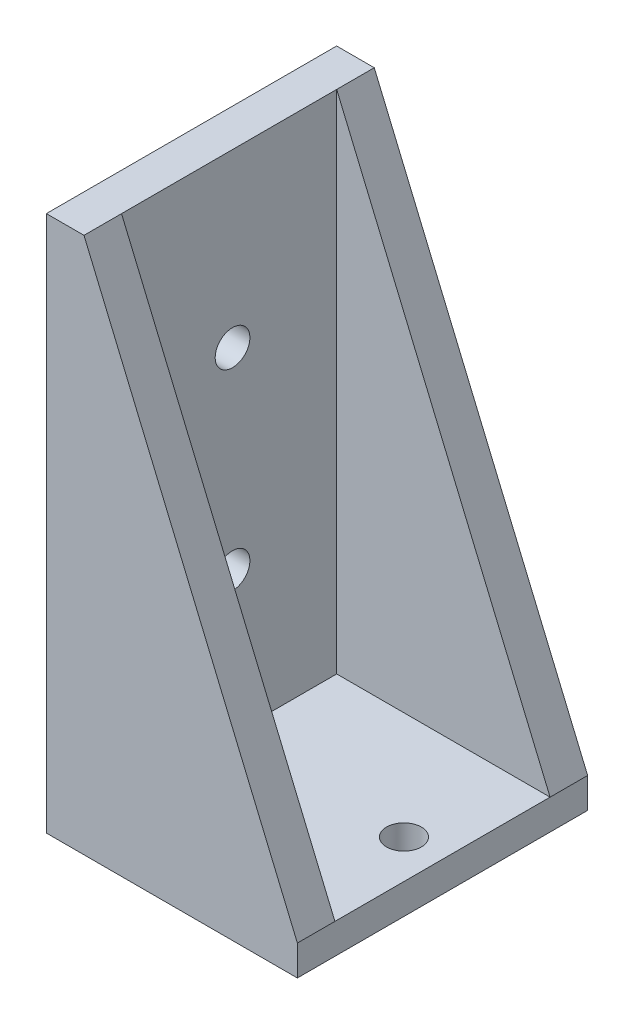
ISO-10303-21;
HEADER;
FILE_DESCRIPTION(('STEP AP214'),'2;1');
FILE_NAME('part.step','',(''),(''),'','','');
FILE_SCHEMA(('AUTOMOTIVE_DESIGN { 1 0 10303 214 1 1 1 1 }'));
ENDSEC;
DATA;
#1=APPLICATION_CONTEXT('core data for automotive mechanical design processes');
#2=APPLICATION_PROTOCOL_DEFINITION('international standard','automotive_design',2000,#1);
#3=PRODUCT_CONTEXT('',#1,'mechanical');
#4=PRODUCT('Part','Part','',(#3));
#5=PRODUCT_RELATED_PRODUCT_CATEGORY('part','',(#4));
#6=PRODUCT_DEFINITION_FORMATION('','',#4);
#7=PRODUCT_DEFINITION_CONTEXT('part definition',#1,'design');
#8=PRODUCT_DEFINITION('design','',#6,#7);
#9=PRODUCT_DEFINITION_SHAPE('','',#8);
#10=(LENGTH_UNIT() NAMED_UNIT(*) SI_UNIT(.MILLI.,.METRE.));
#11=(NAMED_UNIT(*) PLANE_ANGLE_UNIT() SI_UNIT($,.RADIAN.));
#12=(NAMED_UNIT(*) SI_UNIT($,.STERADIAN.) SOLID_ANGLE_UNIT());
#13=UNCERTAINTY_MEASURE_WITH_UNIT(LENGTH_MEASURE(1.E-05),#10,'distance_accuracy_value','');
#14=(GEOMETRIC_REPRESENTATION_CONTEXT(3) GLOBAL_UNCERTAINTY_ASSIGNED_CONTEXT((#13)) GLOBAL_UNIT_ASSIGNED_CONTEXT((#10,
#11,#12)) REPRESENTATION_CONTEXT('',''));
#15=CARTESIAN_POINT('',(0.,0.,0.));
#16=DIRECTION('',(0.,0.,1.));
#17=DIRECTION('',(1.,0.,0.));
#18=AXIS2_PLACEMENT_3D('',#15,#16,#17);
#19=CARTESIAN_POINT('',(1.84333031674209,26.29,14.224));
#20=DIRECTION('',(-0.921482768315552,-0.388419242182345,0.));
#21=DIRECTION('',(0.388419242182345,-0.921482768315552,0.));
#22=AXIS2_PLACEMENT_3D('',#19,#20,#21);
#23=PLANE('',#22);
#24=DIRECTION('',(0.,0.,-1.));
#25=VECTOR('',#24,1.);
#26=CARTESIAN_POINT('',(1.84333031674209,26.29,14.224));
#27=LINE('',#26,#25);
#28=CARTESIAN_POINT('',(1.84333031674209,26.29,1.84));
#29=VERTEX_POINT('',#28);
#30=CARTESIAN_POINT('',(1.84333031674209,26.29,0.));
#31=VERTEX_POINT('',#30);
#32=EDGE_CURVE('E142',#29,#31,#27,.T.);
#33=ORIENTED_EDGE('',*,*,#32,.F.);
#34=DIRECTION('',(0.388419242182345,-0.921482768315552,0.));
#35=VECTOR('',#34,1.);
#36=CARTESIAN_POINT('',(1.84333031674209,26.29,1.84));
#37=LINE('',#36,#35);
#38=CARTESIAN_POINT('',(12.3,1.48267873303167,1.84));
#39=VERTEX_POINT('',#38);
#40=EDGE_CURVE('E11',#29,#39,#37,.T.);
#41=ORIENTED_EDGE('',*,*,#40,.T.);
#42=DIRECTION('',(0.,0.,-1.));
#43=VECTOR('',#42,1.);
#44=CARTESIAN_POINT('',(12.3,1.48267873303167,14.224));
#45=LINE('',#44,#43);
#46=CARTESIAN_POINT('',(12.3,1.48267873303167,0.));
#47=VERTEX_POINT('',#46);
#48=EDGE_CURVE('E119',#39,#47,#45,.T.);
#49=ORIENTED_EDGE('',*,*,#48,.T.);
#50=DIRECTION('',(-0.388419242182345,0.921482768315552,0.));
#51=VECTOR('',#50,1.);
#52=CARTESIAN_POINT('',(1.84333031674209,26.29,0.));
#53=LINE('',#52,#51);
#54=EDGE_CURVE('E136',#47,#31,#53,.T.);
#55=ORIENTED_EDGE('',*,*,#54,.T.);
#56=EDGE_LOOP('',(#33,#41,#49,#55));
#57=FACE_BOUND('',#56,.T.);
#58=ADVANCED_FACE('F33',(#57),#23,.F.);
#59=CARTESIAN_POINT('',(0.,0.,14.224));
#60=DIRECTION('',(1.,0.,0.));
#61=DIRECTION('',(0.,0.,-1.));
#62=AXIS2_PLACEMENT_3D('',#59,#60,#61);
#63=PLANE('',#62);
#64=CARTESIAN_POINT('',(0.,8.41708984317265,6.94399085779678));
#65=DIRECTION('',(-1.,0.,0.));
#66=DIRECTION('',(0.,0.,1.));
#67=AXIS2_PLACEMENT_3D('',#64,#65,#66);
#68=CIRCLE('',#67,0.8509);
#69=CARTESIAN_POINT('',(0.,8.41708984317265,7.79489085779678));
#70=VERTEX_POINT('',#69);
#71=EDGE_CURVE('E160',#70,#70,#68,.T.);
#72=ORIENTED_EDGE('',*,*,#71,.F.);
#73=EDGE_LOOP('',(#72));
#74=FACE_BOUND('',#73,.T.);
#75=CARTESIAN_POINT('',(0.,17.8834712620218,6.94399085779678));
#76=DIRECTION('',(-1.,0.,0.));
#77=DIRECTION('',(0.,0.,1.));
#78=AXIS2_PLACEMENT_3D('',#75,#76,#77);
#79=CIRCLE('',#78,0.850899999999998);
#80=CARTESIAN_POINT('',(0.,17.8834712620218,7.79489085779678));
#81=VERTEX_POINT('',#80);
#82=EDGE_CURVE('E150',#81,#81,#79,.T.);
#83=ORIENTED_EDGE('',*,*,#82,.F.);
#84=EDGE_LOOP('',(#83));
#85=FACE_BOUND('',#84,.T.);
#86=DIRECTION('',(0.,-1.,0.));
#87=VECTOR('',#86,1.);
#88=CARTESIAN_POINT('',(0.,0.,0.));
#89=LINE('',#88,#87);
#90=CARTESIAN_POINT('',(0.,26.29,0.));
#91=VERTEX_POINT('',#90);
#92=CARTESIAN_POINT('',(0.,0.,0.));
#93=VERTEX_POINT('',#92);
#94=EDGE_CURVE('E129',#91,#93,#89,.T.);
#95=ORIENTED_EDGE('',*,*,#94,.T.);
#96=DIRECTION('',(0.,0.,-1.));
#97=VECTOR('',#96,1.);
#98=CARTESIAN_POINT('',(0.,0.,14.224));
#99=LINE('',#98,#97);
#100=CARTESIAN_POINT('',(0.,0.,14.224));
#101=VERTEX_POINT('',#100);
#102=EDGE_CURVE('E145',#101,#93,#99,.T.);
#103=ORIENTED_EDGE('',*,*,#102,.F.);
#104=DIRECTION('',(0.,-1.,0.));
#105=VECTOR('',#104,1.);
#106=CARTESIAN_POINT('',(0.,0.,14.224));
#107=LINE('',#106,#105);
#108=CARTESIAN_POINT('',(0.,26.29,14.224));
#109=VERTEX_POINT('',#108);
#110=EDGE_CURVE('E140',#109,#101,#107,.T.);
#111=ORIENTED_EDGE('',*,*,#110,.F.);
#112=DIRECTION('',(0.,0.,-1.));
#113=VECTOR('',#112,1.);
#114=CARTESIAN_POINT('',(0.,26.29,14.224));
#115=LINE('',#114,#113);
#116=EDGE_CURVE('E125',#109,#91,#115,.T.);
#117=ORIENTED_EDGE('',*,*,#116,.T.);
#118=EDGE_LOOP('',(#95,#103,#111,#117));
#119=FACE_BOUND('',#118,.T.);
#120=ADVANCED_FACE('F35',(#74,#85,#119),#63,.F.);
#121=CARTESIAN_POINT('',(0.,0.,14.224));
#122=DIRECTION('',(0.,1.,0.));
#123=DIRECTION('',(0.,0.,1.));
#124=AXIS2_PLACEMENT_3D('',#121,#122,#123);
#125=PLANE('',#124);
#126=CARTESIAN_POINT('',(0.943553489440477,0.,7.112));
#127=DIRECTION('',(0.,-1.,0.));
#128=DIRECTION('',(0.,0.,-1.));
#129=AXIS2_PLACEMENT_3D('',#126,#127,#128);
#130=CIRCLE('',#129,0.8509);
#131=CARTESIAN_POINT('',(0.943553489440477,0.,6.2611));
#132=VERTEX_POINT('',#131);
#133=EDGE_CURVE('E229',#132,#132,#130,.T.);
#134=ORIENTED_EDGE('',*,*,#133,.F.);
#135=EDGE_LOOP('',(#134));
#136=FACE_BOUND('',#135,.T.);
#137=CARTESIAN_POINT('',(10.4099349082896,0.,7.112));
#138=DIRECTION('',(0.,-1.,0.));
#139=DIRECTION('',(0.,0.,-1.));
#140=AXIS2_PLACEMENT_3D('',#137,#138,#139);
#141=CIRCLE('',#140,0.850900000000001);
#142=CARTESIAN_POINT('',(10.4099349082896,0.,6.2611));
#143=VERTEX_POINT('',#142);
#144=EDGE_CURVE('E232',#143,#143,#141,.T.);
#145=ORIENTED_EDGE('',*,*,#144,.F.);
#146=EDGE_LOOP('',(#145));
#147=FACE_BOUND('',#146,.T.);
#148=DIRECTION('',(1.,0.,0.));
#149=VECTOR('',#148,1.);
#150=CARTESIAN_POINT('',(0.,0.,0.));
#151=LINE('',#150,#149);
#152=CARTESIAN_POINT('',(12.3,0.,0.));
#153=VERTEX_POINT('',#152);
#154=EDGE_CURVE('E132',#93,#153,#151,.T.);
#155=ORIENTED_EDGE('',*,*,#154,.T.);
#156=DIRECTION('',(0.,0.,-1.));
#157=VECTOR('',#156,1.);
#158=CARTESIAN_POINT('',(12.3,0.,14.224));
#159=LINE('',#158,#157);
#160=CARTESIAN_POINT('',(12.3,0.,14.224));
#161=VERTEX_POINT('',#160);
#162=EDGE_CURVE('E118',#161,#153,#159,.T.);
#163=ORIENTED_EDGE('',*,*,#162,.F.);
#164=DIRECTION('',(1.,0.,0.));
#165=VECTOR('',#164,1.);
#166=CARTESIAN_POINT('',(0.,0.,14.224));
#167=LINE('',#166,#165);
#168=EDGE_CURVE('E91',#101,#161,#167,.T.);
#169=ORIENTED_EDGE('',*,*,#168,.F.);
#170=ORIENTED_EDGE('',*,*,#102,.T.);
#171=EDGE_LOOP('',(#155,#163,#169,#170));
#172=FACE_BOUND('',#171,.T.);
#173=ADVANCED_FACE('F181',(#136,#147,#172),#125,.F.);
#174=CARTESIAN_POINT('',(12.3,0.,14.224));
#175=DIRECTION('',(-1.,0.,0.));
#176=DIRECTION('',(0.,0.,1.));
#177=AXIS2_PLACEMENT_3D('',#174,#175,#176);
#178=PLANE('',#177);
#179=DIRECTION('',(0.,1.,0.));
#180=VECTOR('',#179,1.);
#181=CARTESIAN_POINT('',(12.3,0.,0.));
#182=LINE('',#181,#180);
#183=EDGE_CURVE('E134',#153,#47,#182,.T.);
#184=ORIENTED_EDGE('',*,*,#183,.T.);
#185=ORIENTED_EDGE('',*,*,#48,.F.);
#186=DIRECTION('',(0.,0.,-1.));
#187=VECTOR('',#186,1.);
#188=CARTESIAN_POINT('',(12.3,1.48267873303167,1.84));
#189=LINE('',#188,#187);
#190=CARTESIAN_POINT('',(12.3,1.48267873303167,12.384));
#191=VERTEX_POINT('',#190);
#192=EDGE_CURVE('E115',#191,#39,#189,.T.);
#193=ORIENTED_EDGE('',*,*,#192,.F.);
#194=CARTESIAN_POINT('',(12.3,1.48267873303167,14.224));
#195=VERTEX_POINT('',#194);
#196=EDGE_CURVE('E109',#195,#191,#45,.T.);
#197=ORIENTED_EDGE('',*,*,#196,.F.);
#198=DIRECTION('',(0.,1.,0.));
#199=VECTOR('',#198,1.);
#200=CARTESIAN_POINT('',(12.3,0.,14.224));
#201=LINE('',#200,#199);
#202=EDGE_CURVE('E98',#161,#195,#201,.T.);
#203=ORIENTED_EDGE('',*,*,#202,.F.);
#204=ORIENTED_EDGE('',*,*,#162,.T.);
#205=EDGE_LOOP('',(#184,#185,#193,#197,#203,#204));
#206=FACE_BOUND('',#205,.T.);
#207=ADVANCED_FACE('F111',(#206),#178,.F.);
#208=ORIENTED_EDGE('',*,*,#196,.T.);
#209=DIRECTION('',(-0.388419242182345,0.921482768315552,0.));
#210=VECTOR('',#209,1.);
#211=CARTESIAN_POINT('',(1.84333031674209,26.29,12.384));
#212=LINE('',#211,#210);
#213=CARTESIAN_POINT('',(1.84333031674209,26.29,12.384));
#214=VERTEX_POINT('',#213);
#215=EDGE_CURVE('E42',#191,#214,#212,.T.);
#216=ORIENTED_EDGE('',*,*,#215,.T.);
#217=CARTESIAN_POINT('',(1.84333031674209,26.29,14.224));
#218=VERTEX_POINT('',#217);
#219=EDGE_CURVE('E123',#218,#214,#27,.T.);
#220=ORIENTED_EDGE('',*,*,#219,.F.);
#221=DIRECTION('',(-0.388419242182345,0.921482768315552,0.));
#222=VECTOR('',#221,1.);
#223=CARTESIAN_POINT('',(1.84333031674209,26.29,14.224));
#224=LINE('',#223,#222);
#225=EDGE_CURVE('E102',#195,#218,#224,.T.);
#226=ORIENTED_EDGE('',*,*,#225,.F.);
#227=EDGE_LOOP('',(#208,#216,#220,#226));
#228=FACE_BOUND('',#227,.T.);
#229=ADVANCED_FACE('F121',(#228),#23,.F.);
#230=CARTESIAN_POINT('',(0.,26.29,14.224));
#231=DIRECTION('',(0.,-1.,0.));
#232=DIRECTION('',(0.,0.,-1.));
#233=AXIS2_PLACEMENT_3D('',#230,#231,#232);
#234=PLANE('',#233);
#235=DIRECTION('',(-1.,0.,0.));
#236=VECTOR('',#235,1.);
#237=CARTESIAN_POINT('',(0.,26.29,0.));
#238=LINE('',#237,#236);
#239=EDGE_CURVE('E82',#31,#91,#238,.T.);
#240=ORIENTED_EDGE('',*,*,#239,.T.);
#241=ORIENTED_EDGE('',*,*,#116,.F.);
#242=DIRECTION('',(-1.,0.,0.));
#243=VECTOR('',#242,1.);
#244=CARTESIAN_POINT('',(0.,26.29,14.224));
#245=LINE('',#244,#243);
#246=EDGE_CURVE('E59',#218,#109,#245,.T.);
#247=ORIENTED_EDGE('',*,*,#246,.F.);
#248=ORIENTED_EDGE('',*,*,#219,.T.);
#249=DIRECTION('',(0.,0.,1.));
#250=VECTOR('',#249,1.);
#251=CARTESIAN_POINT('',(1.84333031674209,26.29,1.84));
#252=LINE('',#251,#250);
#253=EDGE_CURVE('E149',#29,#214,#252,.T.);
#254=ORIENTED_EDGE('',*,*,#253,.F.);
#255=ORIENTED_EDGE('',*,*,#32,.T.);
#256=EDGE_LOOP('',(#240,#241,#247,#248,#254,#255));
#257=FACE_BOUND('',#256,.T.);
#258=ADVANCED_FACE('F202',(#257),#234,.F.);
#259=CARTESIAN_POINT('',(0.,0.,14.224));
#260=DIRECTION('',(0.,0.,-1.));
#261=DIRECTION('',(-1.,0.,0.));
#262=AXIS2_PLACEMENT_3D('',#259,#260,#261);
#263=PLANE('',#262);
#264=ORIENTED_EDGE('',*,*,#110,.T.);
#265=ORIENTED_EDGE('',*,*,#168,.T.);
#266=ORIENTED_EDGE('',*,*,#202,.T.);
#267=ORIENTED_EDGE('',*,*,#225,.T.);
#268=ORIENTED_EDGE('',*,*,#246,.T.);
#269=EDGE_LOOP('',(#264,#265,#266,#267,#268));
#270=FACE_BOUND('',#269,.T.);
#271=ADVANCED_FACE('F100',(#270),#263,.F.);
#272=CARTESIAN_POINT('',(0.,0.,0.));
#273=DIRECTION('',(0.,0.,-1.));
#274=DIRECTION('',(-1.,0.,0.));
#275=AXIS2_PLACEMENT_3D('',#272,#273,#274);
#276=PLANE('',#275);
#277=ORIENTED_EDGE('',*,*,#94,.F.);
#278=ORIENTED_EDGE('',*,*,#239,.F.);
#279=ORIENTED_EDGE('',*,*,#54,.F.);
#280=ORIENTED_EDGE('',*,*,#183,.F.);
#281=ORIENTED_EDGE('',*,*,#154,.F.);
#282=EDGE_LOOP('',(#277,#278,#279,#280,#281));
#283=FACE_BOUND('',#282,.T.);
#284=ADVANCED_FACE('F185',(#283),#276,.T.);
#285=CARTESIAN_POINT('',(1.84333031674209,1.48267873303167,1.84));
#286=DIRECTION('',(0.,0.,-1.));
#287=DIRECTION('',(-1.,0.,0.));
#288=AXIS2_PLACEMENT_3D('',#285,#286,#287);
#289=PLANE('',#288);
#290=DIRECTION('',(0.,1.,0.));
#291=VECTOR('',#290,1.);
#292=CARTESIAN_POINT('',(1.84333031674209,1.48267873303167,1.84));
#293=LINE('',#292,#291);
#294=CARTESIAN_POINT('',(1.84333031674209,1.48267873303167,1.84));
#295=VERTEX_POINT('',#294);
#296=EDGE_CURVE('E50',#295,#29,#293,.T.);
#297=ORIENTED_EDGE('',*,*,#296,.F.);
#298=DIRECTION('',(-1.,0.,0.));
#299=VECTOR('',#298,1.);
#300=CARTESIAN_POINT('',(1.84333031674209,1.48267873303167,1.84));
#301=LINE('',#300,#299);
#302=EDGE_CURVE('E170',#39,#295,#301,.T.);
#303=ORIENTED_EDGE('',*,*,#302,.F.);
#304=ORIENTED_EDGE('',*,*,#40,.F.);
#305=EDGE_LOOP('',(#297,#303,#304));
#306=FACE_BOUND('',#305,.T.);
#307=ADVANCED_FACE('F267',(#306),#289,.F.);
#308=CARTESIAN_POINT('',(1.84333031674209,1.48267873303167,12.384));
#309=DIRECTION('',(0.,0.,1.));
#310=DIRECTION('',(1.,0.,0.));
#311=AXIS2_PLACEMENT_3D('',#308,#309,#310);
#312=PLANE('',#311);
#313=DIRECTION('',(1.,0.,0.));
#314=VECTOR('',#313,1.);
#315=CARTESIAN_POINT('',(1.84333031674209,1.48267873303167,12.384));
#316=LINE('',#315,#314);
#317=CARTESIAN_POINT('',(1.84333031674209,1.48267873303167,12.384));
#318=VERTEX_POINT('',#317);
#319=EDGE_CURVE('E166',#318,#191,#316,.T.);
#320=ORIENTED_EDGE('',*,*,#319,.F.);
#321=DIRECTION('',(0.,1.,0.));
#322=VECTOR('',#321,1.);
#323=CARTESIAN_POINT('',(1.84333031674209,1.48267873303167,12.384));
#324=LINE('',#323,#322);
#325=EDGE_CURVE('E172',#318,#214,#324,.T.);
#326=ORIENTED_EDGE('',*,*,#325,.T.);
#327=ORIENTED_EDGE('',*,*,#215,.F.);
#328=EDGE_LOOP('',(#320,#326,#327));
#329=FACE_BOUND('',#328,.T.);
#330=ADVANCED_FACE('F200',(#329),#312,.F.);
#331=CARTESIAN_POINT('',(1.84333031674209,1.48267873303167,1.84));
#332=DIRECTION('',(-1.,0.,0.));
#333=DIRECTION('',(0.,0.,1.));
#334=AXIS2_PLACEMENT_3D('',#331,#332,#333);
#335=PLANE('',#334);
#336=CARTESIAN_POINT('',(1.84333031674209,8.41708984317265,6.94399085779678));
#337=DIRECTION('',(-1.,0.,0.));
#338=DIRECTION('',(0.,0.,1.));
#339=AXIS2_PLACEMENT_3D('',#336,#337,#338);
#340=CIRCLE('',#339,0.8509);
#341=CARTESIAN_POINT('',(1.84333031674209,8.41708984317265,7.79489085779678));
#342=VERTEX_POINT('',#341);
#343=EDGE_CURVE('E37',#342,#342,#340,.T.);
#344=ORIENTED_EDGE('',*,*,#343,.T.);
#345=EDGE_LOOP('',(#344));
#346=FACE_BOUND('',#345,.T.);
#347=CARTESIAN_POINT('',(1.84333031674209,17.8834712620218,6.94399085779678));
#348=DIRECTION('',(-1.,0.,0.));
#349=DIRECTION('',(0.,0.,1.));
#350=AXIS2_PLACEMENT_3D('',#347,#348,#349);
#351=CIRCLE('',#350,0.850899999999998);
#352=CARTESIAN_POINT('',(1.84333031674209,17.8834712620218,7.79489085779678));
#353=VERTEX_POINT('',#352);
#354=EDGE_CURVE('E147',#353,#353,#351,.T.);
#355=ORIENTED_EDGE('',*,*,#354,.T.);
#356=EDGE_LOOP('',(#355));
#357=FACE_BOUND('',#356,.T.);
#358=ORIENTED_EDGE('',*,*,#253,.T.);
#359=ORIENTED_EDGE('',*,*,#325,.F.);
#360=DIRECTION('',(0.,0.,1.));
#361=VECTOR('',#360,1.);
#362=CARTESIAN_POINT('',(1.84333031674209,1.48267873303167,1.84));
#363=LINE('',#362,#361);
#364=EDGE_CURVE('E153',#295,#318,#363,.T.);
#365=ORIENTED_EDGE('',*,*,#364,.F.);
#366=ORIENTED_EDGE('',*,*,#296,.T.);
#367=EDGE_LOOP('',(#358,#359,#365,#366));
#368=FACE_BOUND('',#367,.T.);
#369=ADVANCED_FACE('F201',(#346,#357,#368),#335,.F.);
#370=CARTESIAN_POINT('',(0.,1.48267873303167,0.));
#371=DIRECTION('',(0.,1.,0.));
#372=DIRECTION('',(0.,0.,1.));
#373=AXIS2_PLACEMENT_3D('',#370,#371,#372);
#374=PLANE('',#373);
#375=CARTESIAN_POINT('',(10.4099349082896,1.48267873303167,7.112));
#376=DIRECTION('',(0.,1.,0.));
#377=DIRECTION('',(0.,0.,1.));
#378=AXIS2_PLACEMENT_3D('',#375,#376,#377);
#379=CIRCLE('',#378,0.850900000000001);
#380=CARTESIAN_POINT('',(10.4099349082896,1.48267873303167,7.9629));
#381=VERTEX_POINT('',#380);
#382=EDGE_CURVE('E234',#381,#381,#379,.F.);
#383=ORIENTED_EDGE('',*,*,#382,.T.);
#384=EDGE_LOOP('',(#383));
#385=FACE_BOUND('',#384,.T.);
#386=ORIENTED_EDGE('',*,*,#364,.T.);
#387=ORIENTED_EDGE('',*,*,#319,.T.);
#388=ORIENTED_EDGE('',*,*,#192,.T.);
#389=ORIENTED_EDGE('',*,*,#302,.T.);
#390=EDGE_LOOP('',(#386,#387,#388,#389));
#391=FACE_BOUND('',#390,.T.);
#392=ADVANCED_FACE('F264',(#385,#391),#374,.T.);
#393=CARTESIAN_POINT('',(10.,17.8834712620218,6.94399085779678));
#394=DIRECTION('',(-1.,0.,0.));
#395=DIRECTION('',(0.,0.,1.));
#396=AXIS2_PLACEMENT_3D('',#393,#394,#395);
#397=CYLINDRICAL_SURFACE('',#396,0.850899999999998);
#398=ORIENTED_EDGE('',*,*,#82,.T.);
#399=EDGE_LOOP('',(#398));
#400=FACE_BOUND('',#399,.T.);
#401=ORIENTED_EDGE('',*,*,#354,.F.);
#402=EDGE_LOOP('',(#401));
#403=FACE_BOUND('',#402,.T.);
#404=ADVANCED_FACE('F260',(#400,#403),#397,.F.);
#405=CARTESIAN_POINT('',(10.,8.41708984317265,6.94399085779678));
#406=DIRECTION('',(-1.,0.,0.));
#407=DIRECTION('',(0.,0.,1.));
#408=AXIS2_PLACEMENT_3D('',#405,#406,#407);
#409=CYLINDRICAL_SURFACE('',#408,0.8509);
#410=ORIENTED_EDGE('',*,*,#71,.T.);
#411=EDGE_LOOP('',(#410));
#412=FACE_BOUND('',#411,.T.);
#413=ORIENTED_EDGE('',*,*,#343,.F.);
#414=EDGE_LOOP('',(#413));
#415=FACE_BOUND('',#414,.T.);
#416=ADVANCED_FACE('F255',(#412,#415),#409,.F.);
#417=CARTESIAN_POINT('',(10.4099349082896,3.88938737347821,7.112));
#418=DIRECTION('',(0.,-1.,0.));
#419=DIRECTION('',(0.,0.,-1.));
#420=AXIS2_PLACEMENT_3D('',#417,#418,#419);
#421=CYLINDRICAL_SURFACE('',#420,0.850900000000001);
#422=ORIENTED_EDGE('',*,*,#144,.T.);
#423=EDGE_LOOP('',(#422));
#424=FACE_BOUND('',#423,.T.);
#425=ORIENTED_EDGE('',*,*,#382,.F.);
#426=EDGE_LOOP('',(#425));
#427=FACE_BOUND('',#426,.T.);
#428=ADVANCED_FACE('F250',(#424,#427),#421,.F.);
#429=CARTESIAN_POINT('',(0.,1.48267873303167,0.));
#430=DIRECTION('',(0.,1.,0.));
#431=DIRECTION('',(0.,0.,1.));
#432=AXIS2_PLACEMENT_3D('',#429,#430,#431);
#433=PLANE('',#432);
#434=CARTESIAN_POINT('',(0.943553489440477,1.48267873303167,7.112));
#435=DIRECTION('',(0.,1.,0.));
#436=DIRECTION('',(0.,0.,1.));
#437=AXIS2_PLACEMENT_3D('',#434,#435,#436);
#438=CIRCLE('',#437,0.8509);
#439=CARTESIAN_POINT('',(0.943553489440477,1.48267873303167,7.9629));
#440=VERTEX_POINT('',#439);
#441=EDGE_CURVE('E235',#440,#440,#438,.F.);
#442=ORIENTED_EDGE('',*,*,#441,.T.);
#443=EDGE_LOOP('',(#442));
#444=FACE_BOUND('',#443,.T.);
#445=ADVANCED_FACE('F245',(#444),#433,.F.);
#446=CARTESIAN_POINT('',(0.943553489440477,3.88938737347821,7.112));
#447=DIRECTION('',(0.,-1.,0.));
#448=DIRECTION('',(0.,0.,-1.));
#449=AXIS2_PLACEMENT_3D('',#446,#447,#448);
#450=CYLINDRICAL_SURFACE('',#449,0.8509);
#451=ORIENTED_EDGE('',*,*,#133,.T.);
#452=EDGE_LOOP('',(#451));
#453=FACE_BOUND('',#452,.T.);
#454=ORIENTED_EDGE('',*,*,#441,.F.);
#455=EDGE_LOOP('',(#454));
#456=FACE_BOUND('',#455,.T.);
#457=ADVANCED_FACE('F242',(#453,#456),#450,.F.);
#458=CLOSED_SHELL('',(#58,#120,#173,#207,#229,#258,#271,#284,#307,#330,#369,#392,#404,#416,#428,
#445,#457));
#459=MANIFOLD_SOLID_BREP('B2',#458);
#460=ADVANCED_BREP_SHAPE_REPRESENTATION('',(#18,#459),#14);
#461=SHAPE_DEFINITION_REPRESENTATION(#9,#460);
ENDSEC;
END-ISO-10303-21;
